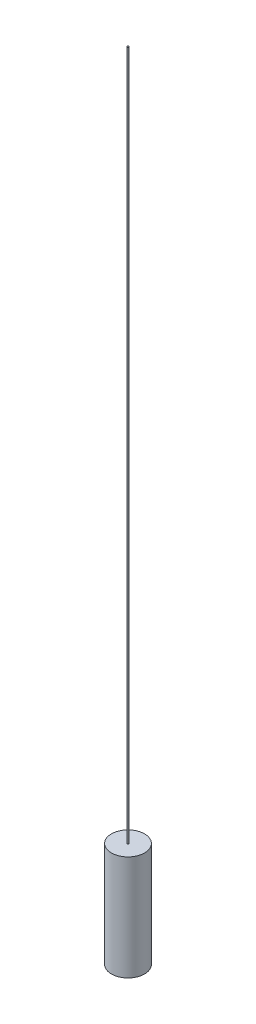
ISO-10303-21;
HEADER;
FILE_DESCRIPTION(('STEP AP214'),'2;1');
FILE_NAME('part.step','',(''),(''),'','','');
FILE_SCHEMA(('AUTOMOTIVE_DESIGN { 1 0 10303 214 1 1 1 1 }'));
ENDSEC;
DATA;
#1=APPLICATION_CONTEXT('core data for automotive mechanical design processes');
#2=APPLICATION_PROTOCOL_DEFINITION('international standard','automotive_design',2000,#1);
#3=PRODUCT_CONTEXT('',#1,'mechanical');
#4=PRODUCT('Part','Part','',(#3));
#5=PRODUCT_RELATED_PRODUCT_CATEGORY('part','',(#4));
#6=PRODUCT_DEFINITION_FORMATION('','',#4);
#7=PRODUCT_DEFINITION_CONTEXT('part definition',#1,'design');
#8=PRODUCT_DEFINITION('design','',#6,#7);
#9=PRODUCT_DEFINITION_SHAPE('','',#8);
#10=(LENGTH_UNIT() NAMED_UNIT(*) SI_UNIT(.MILLI.,.METRE.));
#11=(NAMED_UNIT(*) PLANE_ANGLE_UNIT() SI_UNIT($,.RADIAN.));
#12=(NAMED_UNIT(*) SI_UNIT($,.STERADIAN.) SOLID_ANGLE_UNIT());
#13=UNCERTAINTY_MEASURE_WITH_UNIT(LENGTH_MEASURE(1.E-05),#10,'distance_accuracy_value','');
#14=(GEOMETRIC_REPRESENTATION_CONTEXT(3) GLOBAL_UNCERTAINTY_ASSIGNED_CONTEXT((#13)) GLOBAL_UNIT_ASSIGNED_CONTEXT((#10,
#11,#12)) REPRESENTATION_CONTEXT('',''));
#15=CARTESIAN_POINT('',(0.,0.,0.));
#16=DIRECTION('',(0.,0.,1.));
#17=DIRECTION('',(1.,0.,0.));
#18=AXIS2_PLACEMENT_3D('',#15,#16,#17);
#19=CARTESIAN_POINT('',(0.,38.,0.));
#20=DIRECTION('',(0.,-1.,0.));
#21=DIRECTION('',(0.,0.,-1.));
#22=AXIS2_PLACEMENT_3D('',#19,#20,#21);
#23=CYLINDRICAL_SURFACE('',#22,6.);
#24=CARTESIAN_POINT('',(0.,38.,0.));
#25=DIRECTION('',(0.,1.,0.));
#26=DIRECTION('',(0.,0.,1.));
#27=AXIS2_PLACEMENT_3D('',#24,#25,#26);
#28=CIRCLE('',#27,6.);
#29=CARTESIAN_POINT('',(0.,38.,6.));
#30=VERTEX_POINT('',#29);
#31=EDGE_CURVE('E10',#30,#30,#28,.T.);
#32=ORIENTED_EDGE('',*,*,#31,.F.);
#33=EDGE_LOOP('',(#32));
#34=FACE_BOUND('',#33,.T.);
#35=CARTESIAN_POINT('',(0.,0.,0.));
#36=DIRECTION('',(0.,1.,0.));
#37=DIRECTION('',(0.,0.,1.));
#38=AXIS2_PLACEMENT_3D('',#35,#36,#37);
#39=CIRCLE('',#38,6.);
#40=CARTESIAN_POINT('',(0.,0.,6.));
#41=VERTEX_POINT('',#40);
#42=EDGE_CURVE('E44',#41,#41,#39,.T.);
#43=ORIENTED_EDGE('',*,*,#42,.T.);
#44=EDGE_LOOP('',(#43));
#45=FACE_BOUND('',#44,.T.);
#46=ADVANCED_FACE('F41',(#34,#45),#23,.T.);
#47=CARTESIAN_POINT('',(0.,38.,0.));
#48=DIRECTION('',(0.,1.,0.));
#49=DIRECTION('',(0.,0.,1.));
#50=AXIS2_PLACEMENT_3D('',#47,#48,#49);
#51=PLANE('',#50);
#52=CARTESIAN_POINT('',(0.,38.,0.));
#53=DIRECTION('',(0.,1.,0.));
#54=DIRECTION('',(0.,0.,1.));
#55=AXIS2_PLACEMENT_3D('',#52,#53,#54);
#56=CIRCLE('',#55,0.302488000285752);
#57=CARTESIAN_POINT('',(0.,38.,0.302488000285752));
#58=VERTEX_POINT('',#57);
#59=EDGE_CURVE('E55',#58,#58,#56,.T.);
#60=ORIENTED_EDGE('',*,*,#59,.F.);
#61=EDGE_LOOP('',(#60));
#62=FACE_BOUND('',#61,.T.);
#63=ORIENTED_EDGE('',*,*,#31,.T.);
#64=EDGE_LOOP('',(#63));
#65=FACE_BOUND('',#64,.T.);
#66=ADVANCED_FACE('F72',(#62,#65),#51,.T.);
#67=CARTESIAN_POINT('',(0.,0.,0.));
#68=DIRECTION('',(0.,1.,0.));
#69=DIRECTION('',(0.,0.,1.));
#70=AXIS2_PLACEMENT_3D('',#67,#68,#69);
#71=PLANE('',#70);
#72=ORIENTED_EDGE('',*,*,#42,.F.);
#73=EDGE_LOOP('',(#72));
#74=FACE_BOUND('',#73,.T.);
#75=ADVANCED_FACE('F68',(#74),#71,.F.);
#76=CARTESIAN_POINT('',(0.,288.,0.));
#77=DIRECTION('',(0.,-1.,0.));
#78=DIRECTION('',(0.,0.,-1.));
#79=AXIS2_PLACEMENT_3D('',#76,#77,#78);
#80=CYLINDRICAL_SURFACE('',#79,0.302488000285752);
#81=CARTESIAN_POINT('',(0.,288.,0.));
#82=DIRECTION('',(0.,1.,0.));
#83=DIRECTION('',(0.,0.,1.));
#84=AXIS2_PLACEMENT_3D('',#81,#82,#83);
#85=CIRCLE('',#84,0.302488000285752);
#86=CARTESIAN_POINT('',(0.,288.,0.302488000285752));
#87=VERTEX_POINT('',#86);
#88=EDGE_CURVE('E53',#87,#87,#85,.T.);
#89=ORIENTED_EDGE('',*,*,#88,.F.);
#90=EDGE_LOOP('',(#89));
#91=FACE_BOUND('',#90,.T.);
#92=ORIENTED_EDGE('',*,*,#59,.T.);
#93=EDGE_LOOP('',(#92));
#94=FACE_BOUND('',#93,.T.);
#95=ADVANCED_FACE('F65',(#91,#94),#80,.T.);
#96=CARTESIAN_POINT('',(0.,288.,0.));
#97=DIRECTION('',(0.,1.,0.));
#98=DIRECTION('',(0.,0.,1.));
#99=AXIS2_PLACEMENT_3D('',#96,#97,#98);
#100=PLANE('',#99);
#101=ORIENTED_EDGE('',*,*,#88,.T.);
#102=EDGE_LOOP('',(#101));
#103=FACE_BOUND('',#102,.T.);
#104=ADVANCED_FACE('F63',(#103),#100,.T.);
#105=CLOSED_SHELL('',(#46,#66,#75,#95,#104));
#106=MANIFOLD_SOLID_BREP('B2',#105);
#107=ADVANCED_BREP_SHAPE_REPRESENTATION('',(#18,#106),#14);
#108=SHAPE_DEFINITION_REPRESENTATION(#9,#107);
ENDSEC;
END-ISO-10303-21;
